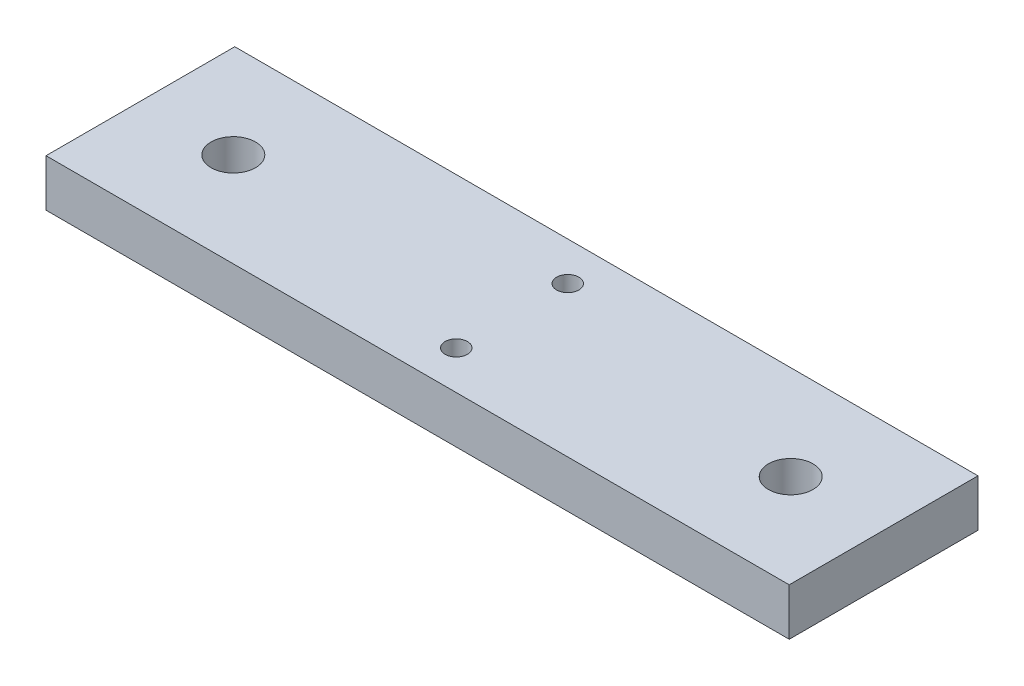
ISO-10303-21;
HEADER;
FILE_DESCRIPTION(('STEP AP214'),'2;1');
FILE_NAME('part.step','',(''),(''),'','','');
FILE_SCHEMA(('AUTOMOTIVE_DESIGN { 1 0 10303 214 1 1 1 1 }'));
ENDSEC;
DATA;
#1=APPLICATION_CONTEXT('core data for automotive mechanical design processes');
#2=APPLICATION_PROTOCOL_DEFINITION('international standard','automotive_design',2000,#1);
#3=PRODUCT_CONTEXT('',#1,'mechanical');
#4=PRODUCT('Part','Part','',(#3));
#5=PRODUCT_RELATED_PRODUCT_CATEGORY('part','',(#4));
#6=PRODUCT_DEFINITION_FORMATION('','',#4);
#7=PRODUCT_DEFINITION_CONTEXT('part definition',#1,'design');
#8=PRODUCT_DEFINITION('design','',#6,#7);
#9=PRODUCT_DEFINITION_SHAPE('','',#8);
#10=(LENGTH_UNIT() NAMED_UNIT(*) SI_UNIT(.MILLI.,.METRE.));
#11=(NAMED_UNIT(*) PLANE_ANGLE_UNIT() SI_UNIT($,.RADIAN.));
#12=(NAMED_UNIT(*) SI_UNIT($,.STERADIAN.) SOLID_ANGLE_UNIT());
#13=UNCERTAINTY_MEASURE_WITH_UNIT(LENGTH_MEASURE(1.E-05),#10,'distance_accuracy_value','');
#14=(GEOMETRIC_REPRESENTATION_CONTEXT(3) GLOBAL_UNCERTAINTY_ASSIGNED_CONTEXT((#13)) GLOBAL_UNIT_ASSIGNED_CONTEXT((#10,
#11,#12)) REPRESENTATION_CONTEXT('',''));
#15=CARTESIAN_POINT('',(0.,0.,0.));
#16=DIRECTION('',(0.,0.,1.));
#17=DIRECTION('',(1.,0.,0.));
#18=AXIS2_PLACEMENT_3D('',#15,#16,#17);
#19=CARTESIAN_POINT('',(0.,12.7,0.));
#20=DIRECTION('',(0.,1.,0.));
#21=DIRECTION('',(0.,0.,1.));
#22=AXIS2_PLACEMENT_3D('',#19,#20,#21);
#23=PLANE('',#22);
#24=CARTESIAN_POINT('',(-75.,12.7,0.));
#25=DIRECTION('',(0.,1.,0.));
#26=DIRECTION('',(0.,0.,1.));
#27=AXIS2_PLACEMENT_3D('',#24,#25,#26);
#28=CIRCLE('',#27,6.);
#29=CARTESIAN_POINT('',(-75.,12.7,6.));
#30=VERTEX_POINT('',#29);
#31=EDGE_CURVE('E121',#30,#30,#28,.T.);
#32=ORIENTED_EDGE('',*,*,#31,.F.);
#33=EDGE_LOOP('',(#32));
#34=FACE_BOUND('',#33,.T.);
#35=CARTESIAN_POINT('',(0.,12.7,-15.));
#36=DIRECTION('',(0.,1.,0.));
#37=DIRECTION('',(0.,0.,1.));
#38=AXIS2_PLACEMENT_3D('',#35,#36,#37);
#39=CIRCLE('',#38,3.);
#40=CARTESIAN_POINT('',(0.,12.7,-12.));
#41=VERTEX_POINT('',#40);
#42=EDGE_CURVE('E100',#41,#41,#39,.T.);
#43=ORIENTED_EDGE('',*,*,#42,.F.);
#44=EDGE_LOOP('',(#43));
#45=FACE_BOUND('',#44,.T.);
#46=DIRECTION('',(0.,0.,1.));
#47=VECTOR('',#46,1.);
#48=CARTESIAN_POINT('',(-100.,12.7,25.4));
#49=LINE('',#48,#47);
#50=CARTESIAN_POINT('',(-100.,12.7,-25.4));
#51=VERTEX_POINT('',#50);
#52=CARTESIAN_POINT('',(-100.,12.7,25.4));
#53=VERTEX_POINT('',#52);
#54=EDGE_CURVE('E85',#51,#53,#49,.T.);
#55=ORIENTED_EDGE('',*,*,#54,.T.);
#56=DIRECTION('',(1.,0.,0.));
#57=VECTOR('',#56,1.);
#58=CARTESIAN_POINT('',(100.,12.7,25.4));
#59=LINE('',#58,#57);
#60=CARTESIAN_POINT('',(100.,12.7,25.4));
#61=VERTEX_POINT('',#60);
#62=EDGE_CURVE('E80',#53,#61,#59,.T.);
#63=ORIENTED_EDGE('',*,*,#62,.T.);
#64=DIRECTION('',(0.,0.,-1.));
#65=VECTOR('',#64,1.);
#66=CARTESIAN_POINT('',(100.,12.7,25.4));
#67=LINE('',#66,#65);
#68=CARTESIAN_POINT('',(100.,12.7,-25.4));
#69=VERTEX_POINT('',#68);
#70=EDGE_CURVE('E83',#61,#69,#67,.T.);
#71=ORIENTED_EDGE('',*,*,#70,.T.);
#72=DIRECTION('',(-1.,0.,0.));
#73=VECTOR('',#72,1.);
#74=CARTESIAN_POINT('',(100.,12.7,-25.4));
#75=LINE('',#74,#73);
#76=EDGE_CURVE('E50',#69,#51,#75,.T.);
#77=ORIENTED_EDGE('',*,*,#76,.T.);
#78=EDGE_LOOP('',(#55,#63,#71,#77));
#79=FACE_BOUND('',#78,.T.);
#80=CARTESIAN_POINT('',(0.,12.7,15.));
#81=DIRECTION('',(0.,1.,0.));
#82=DIRECTION('',(0.,0.,1.));
#83=AXIS2_PLACEMENT_3D('',#80,#81,#82);
#84=CIRCLE('',#83,3.);
#85=CARTESIAN_POINT('',(0.,12.7,18.));
#86=VERTEX_POINT('',#85);
#87=EDGE_CURVE('E115',#86,#86,#84,.T.);
#88=ORIENTED_EDGE('',*,*,#87,.F.);
#89=EDGE_LOOP('',(#88));
#90=FACE_BOUND('',#89,.T.);
#91=CARTESIAN_POINT('',(75.,12.7,0.));
#92=DIRECTION('',(0.,1.,0.));
#93=DIRECTION('',(0.,0.,1.));
#94=AXIS2_PLACEMENT_3D('',#91,#92,#93);
#95=CIRCLE('',#94,6.);
#96=CARTESIAN_POINT('',(75.,12.7,6.));
#97=VERTEX_POINT('',#96);
#98=EDGE_CURVE('E127',#97,#97,#95,.T.);
#99=ORIENTED_EDGE('',*,*,#98,.F.);
#100=EDGE_LOOP('',(#99));
#101=FACE_BOUND('',#100,.T.);
#102=ADVANCED_FACE('F33',(#34,#45,#79,#90,#101),#23,.T.);
#103=CARTESIAN_POINT('',(0.,0.,0.));
#104=DIRECTION('',(0.,1.,0.));
#105=DIRECTION('',(0.,0.,1.));
#106=AXIS2_PLACEMENT_3D('',#103,#104,#105);
#107=PLANE('',#106);
#108=DIRECTION('',(0.,0.,1.));
#109=VECTOR('',#108,1.);
#110=CARTESIAN_POINT('',(-100.,0.,25.4));
#111=LINE('',#110,#109);
#112=CARTESIAN_POINT('',(-100.,0.,-25.4));
#113=VERTEX_POINT('',#112);
#114=CARTESIAN_POINT('',(-100.,0.,25.4));
#115=VERTEX_POINT('',#114);
#116=EDGE_CURVE('E97',#113,#115,#111,.T.);
#117=ORIENTED_EDGE('',*,*,#116,.F.);
#118=DIRECTION('',(-1.,0.,0.));
#119=VECTOR('',#118,1.);
#120=CARTESIAN_POINT('',(100.,0.,-25.4));
#121=LINE('',#120,#119);
#122=CARTESIAN_POINT('',(100.,0.,-25.4));
#123=VERTEX_POINT('',#122);
#124=EDGE_CURVE('E73',#123,#113,#121,.T.);
#125=ORIENTED_EDGE('',*,*,#124,.F.);
#126=DIRECTION('',(0.,0.,-1.));
#127=VECTOR('',#126,1.);
#128=CARTESIAN_POINT('',(100.,0.,25.4));
#129=LINE('',#128,#127);
#130=CARTESIAN_POINT('',(100.,0.,25.4));
#131=VERTEX_POINT('',#130);
#132=EDGE_CURVE('E67',#131,#123,#129,.T.);
#133=ORIENTED_EDGE('',*,*,#132,.F.);
#134=DIRECTION('',(1.,0.,0.));
#135=VECTOR('',#134,1.);
#136=CARTESIAN_POINT('',(100.,0.,25.4));
#137=LINE('',#136,#135);
#138=EDGE_CURVE('E89',#115,#131,#137,.T.);
#139=ORIENTED_EDGE('',*,*,#138,.F.);
#140=EDGE_LOOP('',(#117,#125,#133,#139));
#141=FACE_BOUND('',#140,.T.);
#142=CARTESIAN_POINT('',(0.,0.,-15.));
#143=DIRECTION('',(0.,1.,0.));
#144=DIRECTION('',(0.,0.,1.));
#145=AXIS2_PLACEMENT_3D('',#142,#143,#144);
#146=CIRCLE('',#145,3.);
#147=CARTESIAN_POINT('',(0.,0.,-12.));
#148=VERTEX_POINT('',#147);
#149=EDGE_CURVE('E112',#148,#148,#146,.T.);
#150=ORIENTED_EDGE('',*,*,#149,.T.);
#151=EDGE_LOOP('',(#150));
#152=FACE_BOUND('',#151,.T.);
#153=CARTESIAN_POINT('',(0.,0.,15.));
#154=DIRECTION('',(0.,1.,0.));
#155=DIRECTION('',(0.,0.,1.));
#156=AXIS2_PLACEMENT_3D('',#153,#154,#155);
#157=CIRCLE('',#156,3.);
#158=CARTESIAN_POINT('',(0.,0.,18.));
#159=VERTEX_POINT('',#158);
#160=EDGE_CURVE('E118',#159,#159,#157,.T.);
#161=ORIENTED_EDGE('',*,*,#160,.T.);
#162=EDGE_LOOP('',(#161));
#163=FACE_BOUND('',#162,.T.);
#164=CARTESIAN_POINT('',(-75.,0.,0.));
#165=DIRECTION('',(0.,1.,0.));
#166=DIRECTION('',(0.,0.,1.));
#167=AXIS2_PLACEMENT_3D('',#164,#165,#166);
#168=CIRCLE('',#167,6.);
#169=CARTESIAN_POINT('',(-75.,0.,6.));
#170=VERTEX_POINT('',#169);
#171=EDGE_CURVE('E124',#170,#170,#168,.T.);
#172=ORIENTED_EDGE('',*,*,#171,.T.);
#173=EDGE_LOOP('',(#172));
#174=FACE_BOUND('',#173,.T.);
#175=CARTESIAN_POINT('',(75.,0.,0.));
#176=DIRECTION('',(0.,1.,0.));
#177=DIRECTION('',(0.,0.,1.));
#178=AXIS2_PLACEMENT_3D('',#175,#176,#177);
#179=CIRCLE('',#178,6.);
#180=CARTESIAN_POINT('',(75.,0.,6.));
#181=VERTEX_POINT('',#180);
#182=EDGE_CURVE('E130',#181,#181,#179,.T.);
#183=ORIENTED_EDGE('',*,*,#182,.T.);
#184=EDGE_LOOP('',(#183));
#185=FACE_BOUND('',#184,.T.);
#186=ADVANCED_FACE('F108',(#141,#152,#163,#174,#185),#107,.F.);
#187=CARTESIAN_POINT('',(-100.,12.7,25.4));
#188=DIRECTION('',(1.,0.,0.));
#189=DIRECTION('',(0.,0.,-1.));
#190=AXIS2_PLACEMENT_3D('',#187,#188,#189);
#191=PLANE('',#190);
#192=ORIENTED_EDGE('',*,*,#116,.T.);
#193=DIRECTION('',(0.,-1.,0.));
#194=VECTOR('',#193,1.);
#195=CARTESIAN_POINT('',(-100.,12.7,25.4));
#196=LINE('',#195,#194);
#197=EDGE_CURVE('E11',#53,#115,#196,.T.);
#198=ORIENTED_EDGE('',*,*,#197,.F.);
#199=ORIENTED_EDGE('',*,*,#54,.F.);
#200=DIRECTION('',(0.,-1.,0.));
#201=VECTOR('',#200,1.);
#202=CARTESIAN_POINT('',(-100.,12.7,-25.4));
#203=LINE('',#202,#201);
#204=EDGE_CURVE('E93',#51,#113,#203,.T.);
#205=ORIENTED_EDGE('',*,*,#204,.T.);
#206=EDGE_LOOP('',(#192,#198,#199,#205));
#207=FACE_BOUND('',#206,.T.);
#208=ADVANCED_FACE('F35',(#207),#191,.F.);
#209=CARTESIAN_POINT('',(100.,12.7,25.4));
#210=DIRECTION('',(0.,0.,-1.));
#211=DIRECTION('',(-1.,0.,0.));
#212=AXIS2_PLACEMENT_3D('',#209,#210,#211);
#213=PLANE('',#212);
#214=ORIENTED_EDGE('',*,*,#138,.T.);
#215=DIRECTION('',(0.,-1.,0.));
#216=VECTOR('',#215,1.);
#217=CARTESIAN_POINT('',(100.,12.7,25.4));
#218=LINE('',#217,#216);
#219=EDGE_CURVE('E42',#61,#131,#218,.T.);
#220=ORIENTED_EDGE('',*,*,#219,.F.);
#221=ORIENTED_EDGE('',*,*,#62,.F.);
#222=ORIENTED_EDGE('',*,*,#197,.T.);
#223=EDGE_LOOP('',(#214,#220,#221,#222));
#224=FACE_BOUND('',#223,.T.);
#225=ADVANCED_FACE('F88',(#224),#213,.F.);
#226=CARTESIAN_POINT('',(100.,12.7,25.4));
#227=DIRECTION('',(-1.,0.,0.));
#228=DIRECTION('',(0.,0.,1.));
#229=AXIS2_PLACEMENT_3D('',#226,#227,#228);
#230=PLANE('',#229);
#231=ORIENTED_EDGE('',*,*,#132,.T.);
#232=DIRECTION('',(0.,-1.,0.));
#233=VECTOR('',#232,1.);
#234=CARTESIAN_POINT('',(100.,12.7,-25.4));
#235=LINE('',#234,#233);
#236=EDGE_CURVE('E90',#69,#123,#235,.T.);
#237=ORIENTED_EDGE('',*,*,#236,.F.);
#238=ORIENTED_EDGE('',*,*,#70,.F.);
#239=ORIENTED_EDGE('',*,*,#219,.T.);
#240=EDGE_LOOP('',(#231,#237,#238,#239));
#241=FACE_BOUND('',#240,.T.);
#242=ADVANCED_FACE('F91',(#241),#230,.F.);
#243=CARTESIAN_POINT('',(100.,12.7,-25.4));
#244=DIRECTION('',(0.,0.,1.));
#245=DIRECTION('',(1.,0.,0.));
#246=AXIS2_PLACEMENT_3D('',#243,#244,#245);
#247=PLANE('',#246);
#248=ORIENTED_EDGE('',*,*,#124,.T.);
#249=ORIENTED_EDGE('',*,*,#204,.F.);
#250=ORIENTED_EDGE('',*,*,#76,.F.);
#251=ORIENTED_EDGE('',*,*,#236,.T.);
#252=EDGE_LOOP('',(#248,#249,#250,#251));
#253=FACE_BOUND('',#252,.T.);
#254=ADVANCED_FACE('F105',(#253),#247,.F.);
#255=CARTESIAN_POINT('',(0.,12.7,-15.));
#256=DIRECTION('',(0.,-1.,0.));
#257=DIRECTION('',(0.,0.,-1.));
#258=AXIS2_PLACEMENT_3D('',#255,#256,#257);
#259=CYLINDRICAL_SURFACE('',#258,3.);
#260=ORIENTED_EDGE('',*,*,#42,.T.);
#261=EDGE_LOOP('',(#260));
#262=FACE_BOUND('',#261,.T.);
#263=ORIENTED_EDGE('',*,*,#149,.F.);
#264=EDGE_LOOP('',(#263));
#265=FACE_BOUND('',#264,.T.);
#266=ADVANCED_FACE('F149',(#262,#265),#259,.F.);
#267=CARTESIAN_POINT('',(0.,12.7,15.));
#268=DIRECTION('',(0.,-1.,0.));
#269=DIRECTION('',(0.,0.,-1.));
#270=AXIS2_PLACEMENT_3D('',#267,#268,#269);
#271=CYLINDRICAL_SURFACE('',#270,3.);
#272=ORIENTED_EDGE('',*,*,#87,.T.);
#273=EDGE_LOOP('',(#272));
#274=FACE_BOUND('',#273,.T.);
#275=ORIENTED_EDGE('',*,*,#160,.F.);
#276=EDGE_LOOP('',(#275));
#277=FACE_BOUND('',#276,.T.);
#278=ADVANCED_FACE('F195',(#274,#277),#271,.F.);
#279=CARTESIAN_POINT('',(-75.,12.7,0.));
#280=DIRECTION('',(0.,-1.,0.));
#281=DIRECTION('',(0.,0.,-1.));
#282=AXIS2_PLACEMENT_3D('',#279,#280,#281);
#283=CYLINDRICAL_SURFACE('',#282,6.);
#284=ORIENTED_EDGE('',*,*,#31,.T.);
#285=EDGE_LOOP('',(#284));
#286=FACE_BOUND('',#285,.T.);
#287=ORIENTED_EDGE('',*,*,#171,.F.);
#288=EDGE_LOOP('',(#287));
#289=FACE_BOUND('',#288,.T.);
#290=ADVANCED_FACE('F203',(#286,#289),#283,.F.);
#291=CARTESIAN_POINT('',(75.,12.7,0.));
#292=DIRECTION('',(0.,-1.,0.));
#293=DIRECTION('',(0.,0.,-1.));
#294=AXIS2_PLACEMENT_3D('',#291,#292,#293);
#295=CYLINDRICAL_SURFACE('',#294,6.);
#296=ORIENTED_EDGE('',*,*,#98,.T.);
#297=EDGE_LOOP('',(#296));
#298=FACE_BOUND('',#297,.T.);
#299=ORIENTED_EDGE('',*,*,#182,.F.);
#300=EDGE_LOOP('',(#299));
#301=FACE_BOUND('',#300,.T.);
#302=ADVANCED_FACE('F136',(#298,#301),#295,.F.);
#303=CLOSED_SHELL('',(#102,#186,#208,#225,#242,#254,#266,#278,#290,#302));
#304=MANIFOLD_SOLID_BREP('B2',#303);
#305=ADVANCED_BREP_SHAPE_REPRESENTATION('',(#18,#304),#14);
#306=SHAPE_DEFINITION_REPRESENTATION(#9,#305);
ENDSEC;
END-ISO-10303-21;
